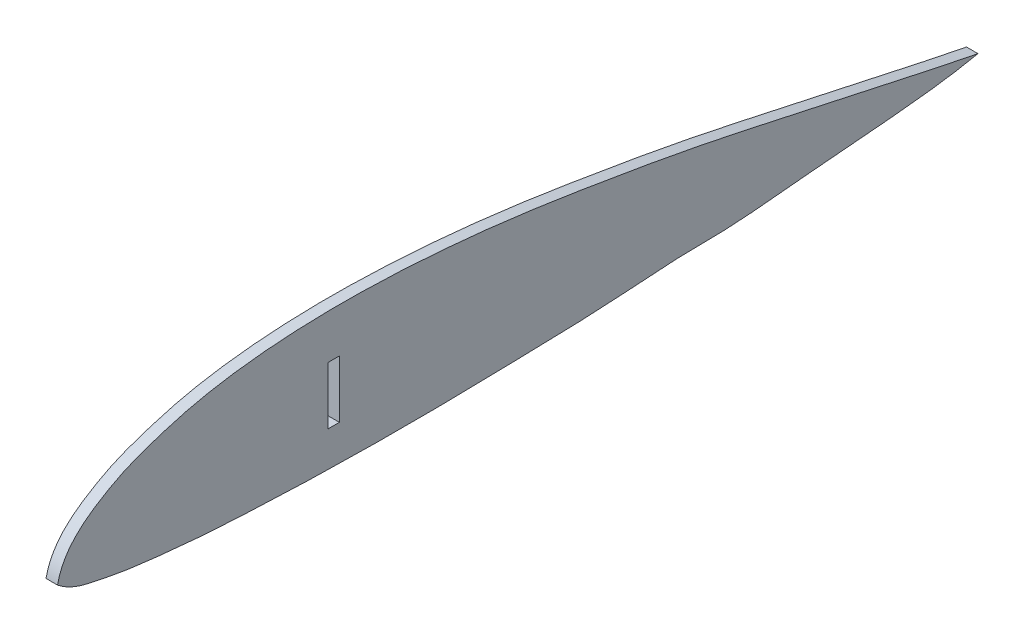
ISO-10303-21;
HEADER;
FILE_DESCRIPTION(('STEP AP214'),'2;1');
FILE_NAME('part.step','',(''),(''),'','','');
FILE_SCHEMA(('AUTOMOTIVE_DESIGN { 1 0 10303 214 1 1 1 1 }'));
ENDSEC;
DATA;
#1=APPLICATION_CONTEXT('core data for automotive mechanical design processes');
#2=APPLICATION_PROTOCOL_DEFINITION('international standard','automotive_design',2000,#1);
#3=PRODUCT_CONTEXT('',#1,'mechanical');
#4=PRODUCT('Part','Part','',(#3));
#5=PRODUCT_RELATED_PRODUCT_CATEGORY('part','',(#4));
#6=PRODUCT_DEFINITION_FORMATION('','',#4);
#7=PRODUCT_DEFINITION_CONTEXT('part definition',#1,'design');
#8=PRODUCT_DEFINITION('design','',#6,#7);
#9=PRODUCT_DEFINITION_SHAPE('','',#8);
#10=(LENGTH_UNIT() NAMED_UNIT(*) SI_UNIT(.MILLI.,.METRE.));
#11=(NAMED_UNIT(*) PLANE_ANGLE_UNIT() SI_UNIT($,.RADIAN.));
#12=(NAMED_UNIT(*) SI_UNIT($,.STERADIAN.) SOLID_ANGLE_UNIT());
#13=UNCERTAINTY_MEASURE_WITH_UNIT(LENGTH_MEASURE(1.E-05),#10,'distance_accuracy_value','');
#14=(GEOMETRIC_REPRESENTATION_CONTEXT(3) GLOBAL_UNCERTAINTY_ASSIGNED_CONTEXT((#13)) GLOBAL_UNIT_ASSIGNED_CONTEXT((#10,
#11,#12)) REPRESENTATION_CONTEXT('',''));
#15=CARTESIAN_POINT('',(0.,0.,0.));
#16=DIRECTION('',(0.,0.,1.));
#17=DIRECTION('',(1.,0.,0.));
#18=AXIS2_PLACEMENT_3D('',#15,#16,#17);
#19=CARTESIAN_POINT('',(3.,0.,240.));
#20=CARTESIAN_POINT('',(3.,-2.88663712280927,236.523911789921));
#21=CARTESIAN_POINT('',(3.,-4.06778606087941,230.220810861395));
#22=CARTESIAN_POINT('',(3.,-5.64877990651582,222.028601874124));
#23=CARTESIAN_POINT('',(3.,-6.60851401532716,214.009642515101));
#24=CARTESIAN_POINT('',(3.,-7.65058139006474,204.019456847261));
#25=CARTESIAN_POINT('',(3.,-8.62100436946901,188.0105436438));
#26=CARTESIAN_POINT('',(3.,-9.35502805275515,168.008371033474));
#27=CARTESIAN_POINT('',(3.,-9.54465584837777,143.997445941081));
#28=CARTESIAN_POINT('',(3.,-9.00057164569615,119.996434597562));
#29=CARTESIAN_POINT('',(3.,-8.45231331914167,95.9841207137069));
#30=CARTESIAN_POINT('',(3.,-6.86154925632092,79.4444514819222));
#31=CARTESIAN_POINT('',(3.,-6.94135781790873,63.4128510279465));
#32=CARTESIAN_POINT('',(3.,-5.14929657813988,47.4214800178839));
#33=CARTESIAN_POINT('',(3.,-3.34616289016771,23.9519910613881));
#34=CARTESIAN_POINT('',(3.,-1.67223814751534,7.91601145609598));
#35=CARTESIAN_POINT('',(3.,0.,0.));
#36=B_SPLINE_CURVE_WITH_KNOTS('',3,(#19,#20,#21,#22,#23,#24,#25,#26,#27,#28,#29,#30,#31,#32,#33,
#34,#35),.UNSPECIFIED.,.F.,.F.,(4,1,1,1,1,1,1,1,1,1,1,1,1,1,4),(0.,0.0534752742490124,
0.078709310431568,0.103753203869046,0.153672751320013,0.203448048800785,0.302856430572072,
0.402198969890009,0.501554024856561,0.600954522211836,0.700430480598882,0.70748041607058,
0.79999645484155,0.899715684831644,1.),.UNSPECIFIED.);
#37=DIRECTION('',(-1.,0.,0.));
#38=VECTOR('',#37,1.);
#39=SURFACE_OF_LINEAR_EXTRUSION('',#36,#38);
#40=CARTESIAN_POINT('',(0.,0.,240.));
#41=CARTESIAN_POINT('',(0.,-2.88663712280927,236.523911789921));
#42=CARTESIAN_POINT('',(0.,-4.06778606087941,230.220810861395));
#43=CARTESIAN_POINT('',(0.,-5.64877990651582,222.028601874124));
#44=CARTESIAN_POINT('',(0.,-6.60851401532716,214.009642515101));
#45=CARTESIAN_POINT('',(0.,-7.65058139006474,204.019456847261));
#46=CARTESIAN_POINT('',(0.,-8.62100436946901,188.0105436438));
#47=CARTESIAN_POINT('',(0.,-9.35502805275515,168.008371033474));
#48=CARTESIAN_POINT('',(0.,-9.54465584837777,143.997445941081));
#49=CARTESIAN_POINT('',(0.,-9.00057164569615,119.996434597562));
#50=CARTESIAN_POINT('',(0.,-8.45231331914167,95.9841207137069));
#51=CARTESIAN_POINT('',(0.,-6.86154925632092,79.4444514819222));
#52=CARTESIAN_POINT('',(0.,-6.94135781790873,63.4128510279465));
#53=CARTESIAN_POINT('',(0.,-5.14929657813988,47.4214800178839));
#54=CARTESIAN_POINT('',(0.,-3.34616289016771,23.9519910613881));
#55=CARTESIAN_POINT('',(0.,-1.67223814751534,7.91601145609598));
#56=CARTESIAN_POINT('',(0.,0.,0.));
#57=B_SPLINE_CURVE_WITH_KNOTS('',3,(#40,#41,#42,#43,#44,#45,#46,#47,#48,#49,#50,#51,#52,#53,#54,
#55,#56),.UNSPECIFIED.,.F.,.F.,(4,1,1,1,1,1,1,1,1,1,1,1,1,1,4),(0.,0.0534752742490124,
0.078709310431568,0.103753203869046,0.153672751320013,0.203448048800785,0.302856430572072,
0.402198969890009,0.501554024856561,0.600954522211836,0.700430480598882,0.70748041607058,
0.79999645484155,0.899715684831644,1.),.UNSPECIFIED.);
#58=CARTESIAN_POINT('',(0.,0.,240.));
#59=VERTEX_POINT('',#58);
#60=CARTESIAN_POINT('',(0.,0.,0.));
#61=VERTEX_POINT('',#60);
#62=EDGE_CURVE('E139',#59,#61,#57,.T.);
#63=ORIENTED_EDGE('',*,*,#62,.T.);
#64=DIRECTION('',(-1.,0.,0.));
#65=VECTOR('',#64,1.);
#66=CARTESIAN_POINT('',(3.,0.,0.));
#67=LINE('',#66,#65);
#68=CARTESIAN_POINT('',(3.,0.,0.));
#69=VERTEX_POINT('',#68);
#70=EDGE_CURVE('E11',#69,#61,#67,.T.);
#71=ORIENTED_EDGE('',*,*,#70,.F.);
#72=CARTESIAN_POINT('',(3.,0.,240.));
#73=VERTEX_POINT('',#72);
#74=EDGE_CURVE('E144',#73,#69,#36,.T.);
#75=ORIENTED_EDGE('',*,*,#74,.F.);
#76=DIRECTION('',(-1.,0.,0.));
#77=VECTOR('',#76,1.);
#78=CARTESIAN_POINT('',(3.,0.,240.));
#79=LINE('',#78,#77);
#80=EDGE_CURVE('E51',#73,#59,#79,.T.);
#81=ORIENTED_EDGE('',*,*,#80,.T.);
#82=EDGE_LOOP('',(#63,#71,#75,#81));
#83=FACE_BOUND('',#82,.T.);
#84=ADVANCED_FACE('F42',(#83),#39,.F.);
#85=CARTESIAN_POINT('',(3.,0.,0.));
#86=CARTESIAN_POINT('',(3.,1.52360068225762,8.03746926130975));
#87=CARTESIAN_POINT('',(3.,5.17138323074117,23.9897917168263));
#88=CARTESIAN_POINT('',(3.,10.2205786034995,48.0059783922376));
#89=CARTESIAN_POINT('',(3.,15.5619770262737,71.9126579513757));
#90=CARTESIAN_POINT('',(3.,19.7588120032883,95.9537600079154));
#91=CARTESIAN_POINT('',(3.,23.5677508672796,119.918298993928));
#92=CARTESIAN_POINT('',(3.,26.0263882263808,143.945589986485));
#93=CARTESIAN_POINT('',(3.,26.9601439821251,168.007150596988));
#94=CARTESIAN_POINT('',(3.,25.8933216802265,188.104616678397));
#95=CARTESIAN_POINT('',(3.,23.2639042392419,204.156129060536));
#96=CARTESIAN_POINT('',(3.,20.3434828261758,214.111867769092));
#97=CARTESIAN_POINT('',(3.,17.4120912155664,222.175332594537));
#98=CARTESIAN_POINT('',(3.,12.3378274401084,231.611968899749));
#99=CARTESIAN_POINT('',(3.,6.88597595591278,238.539586147514));
#100=CARTESIAN_POINT('',(3.,0.,240.));
#101=B_SPLINE_CURVE_WITH_KNOTS('',3,(#85,#86,#87,#88,#89,#90,#91,#92,#93,#94,#95,#96,#97,#98,
#99,#100),.UNSPECIFIED.,.F.,.F.,(4,1,1,1,1,1,1,1,1,1,1,1,1,4),(0.,0.0976537739938577,
0.195364998835535,0.293026196954694,0.390079704897671,0.486695277187024,0.582699676897636,
0.678273314662547,0.77397516907434,0.822435696462195,0.872109787552887,0.897672395288057,
0.924653988799848,1.),.UNSPECIFIED.);
#102=DIRECTION('',(-1.,0.,0.));
#103=VECTOR('',#102,1.);
#104=SURFACE_OF_LINEAR_EXTRUSION('',#101,#103);
#105=CARTESIAN_POINT('',(0.,0.,0.));
#106=CARTESIAN_POINT('',(0.,1.52360068225762,8.03746926130975));
#107=CARTESIAN_POINT('',(0.,5.17138323074117,23.9897917168263));
#108=CARTESIAN_POINT('',(0.,10.2205786034995,48.0059783922376));
#109=CARTESIAN_POINT('',(0.,15.5619770262737,71.9126579513757));
#110=CARTESIAN_POINT('',(0.,19.7588120032883,95.9537600079154));
#111=CARTESIAN_POINT('',(0.,23.5677508672796,119.918298993928));
#112=CARTESIAN_POINT('',(0.,26.0263882263808,143.945589986485));
#113=CARTESIAN_POINT('',(0.,26.9601439821251,168.007150596988));
#114=CARTESIAN_POINT('',(0.,25.8933216802265,188.104616678397));
#115=CARTESIAN_POINT('',(0.,23.2639042392419,204.156129060536));
#116=CARTESIAN_POINT('',(0.,20.3434828261758,214.111867769092));
#117=CARTESIAN_POINT('',(0.,17.4120912155664,222.175332594537));
#118=CARTESIAN_POINT('',(0.,12.3378274401084,231.611968899749));
#119=CARTESIAN_POINT('',(0.,6.88597595591278,238.539586147514));
#120=CARTESIAN_POINT('',(0.,0.,240.));
#121=B_SPLINE_CURVE_WITH_KNOTS('',3,(#105,#106,#107,#108,#109,#110,#111,#112,#113,#114,#115,
#116,#117,#118,#119,#120),.UNSPECIFIED.,.F.,.F.,(4,1,1,1,1,1,1,1,1,1,1,1,1,4),(0.,
0.0976537739938577,0.195364998835535,0.293026196954694,0.390079704897671,0.486695277187024,
0.582699676897636,0.678273314662547,0.77397516907434,0.822435696462195,0.872109787552887,
0.897672395288057,0.924653988799848,1.),.UNSPECIFIED.);
#122=EDGE_CURVE('E152',#61,#59,#121,.T.);
#123=ORIENTED_EDGE('',*,*,#122,.T.);
#124=ORIENTED_EDGE('',*,*,#80,.F.);
#125=EDGE_CURVE('E151',#69,#73,#101,.T.);
#126=ORIENTED_EDGE('',*,*,#125,.F.);
#127=ORIENTED_EDGE('',*,*,#70,.T.);
#128=EDGE_LOOP('',(#123,#124,#126,#127));
#129=FACE_BOUND('',#128,.T.);
#130=ADVANCED_FACE('F167',(#129),#104,.F.);
#131=CARTESIAN_POINT('',(3.,-9.00853891874286,120.375365675922));
#132=DIRECTION('',(-1.,0.,0.));
#133=DIRECTION('',(0.,0.,1.));
#134=AXIS2_PLACEMENT_3D('',#131,#132,#133);
#135=PLANE('',#134);
#136=DIRECTION('',(0.,-1.,0.));
#137=VECTOR('',#136,1.);
#138=CARTESIAN_POINT('',(3.,15.,166.5));
#139=LINE('',#138,#137);
#140=CARTESIAN_POINT('',(3.,15.,166.5));
#141=VERTEX_POINT('',#140);
#142=CARTESIAN_POINT('',(3.,0.,166.5));
#143=VERTEX_POINT('',#142);
#144=EDGE_CURVE('E105',#141,#143,#139,.T.);
#145=ORIENTED_EDGE('',*,*,#144,.T.);
#146=DIRECTION('',(0.,0.,1.));
#147=VECTOR('',#146,1.);
#148=CARTESIAN_POINT('',(3.,0.,166.5));
#149=LINE('',#148,#147);
#150=CARTESIAN_POINT('',(3.,0.,169.5));
#151=VERTEX_POINT('',#150);
#152=EDGE_CURVE('E98',#143,#151,#149,.T.);
#153=ORIENTED_EDGE('',*,*,#152,.T.);
#154=DIRECTION('',(0.,1.,0.));
#155=VECTOR('',#154,1.);
#156=CARTESIAN_POINT('',(3.,0.,169.5));
#157=LINE('',#156,#155);
#158=CARTESIAN_POINT('',(3.,15.,169.5));
#159=VERTEX_POINT('',#158);
#160=EDGE_CURVE('E108',#151,#159,#157,.T.);
#161=ORIENTED_EDGE('',*,*,#160,.T.);
#162=DIRECTION('',(0.,0.,-1.));
#163=VECTOR('',#162,1.);
#164=CARTESIAN_POINT('',(3.,15.,169.5));
#165=LINE('',#164,#163);
#166=EDGE_CURVE('E58',#159,#141,#165,.T.);
#167=ORIENTED_EDGE('',*,*,#166,.T.);
#168=EDGE_LOOP('',(#145,#153,#161,#167));
#169=FACE_BOUND('',#168,.T.);
#170=ORIENTED_EDGE('',*,*,#74,.T.);
#171=ORIENTED_EDGE('',*,*,#125,.T.);
#172=EDGE_LOOP('',(#170,#171));
#173=FACE_BOUND('',#172,.T.);
#174=ADVANCED_FACE('F113',(#169,#173),#135,.F.);
#175=CARTESIAN_POINT('',(0.,-9.00853891874286,120.375365675922));
#176=DIRECTION('',(-1.,0.,0.));
#177=DIRECTION('',(0.,0.,1.));
#178=AXIS2_PLACEMENT_3D('',#175,#176,#177);
#179=PLANE('',#178);
#180=DIRECTION('',(0.,0.,1.));
#181=VECTOR('',#180,1.);
#182=CARTESIAN_POINT('',(0.,0.,166.5));
#183=LINE('',#182,#181);
#184=CARTESIAN_POINT('',(0.,0.,166.5));
#185=VERTEX_POINT('',#184);
#186=CARTESIAN_POINT('',(0.,0.,169.5));
#187=VERTEX_POINT('',#186);
#188=EDGE_CURVE('E66',#185,#187,#183,.T.);
#189=ORIENTED_EDGE('',*,*,#188,.F.);
#190=DIRECTION('',(0.,-1.,0.));
#191=VECTOR('',#190,1.);
#192=CARTESIAN_POINT('',(0.,15.,166.5));
#193=LINE('',#192,#191);
#194=CARTESIAN_POINT('',(0.,15.,166.5));
#195=VERTEX_POINT('',#194);
#196=EDGE_CURVE('E117',#195,#185,#193,.T.);
#197=ORIENTED_EDGE('',*,*,#196,.F.);
#198=DIRECTION('',(0.,0.,-1.));
#199=VECTOR('',#198,1.);
#200=CARTESIAN_POINT('',(0.,15.,169.5));
#201=LINE('',#200,#199);
#202=CARTESIAN_POINT('',(0.,15.,169.5));
#203=VERTEX_POINT('',#202);
#204=EDGE_CURVE('E121',#203,#195,#201,.T.);
#205=ORIENTED_EDGE('',*,*,#204,.F.);
#206=DIRECTION('',(0.,1.,0.));
#207=VECTOR('',#206,1.);
#208=CARTESIAN_POINT('',(0.,0.,169.5));
#209=LINE('',#208,#207);
#210=EDGE_CURVE('E130',#187,#203,#209,.T.);
#211=ORIENTED_EDGE('',*,*,#210,.F.);
#212=EDGE_LOOP('',(#189,#197,#205,#211));
#213=FACE_BOUND('',#212,.T.);
#214=ORIENTED_EDGE('',*,*,#62,.F.);
#215=ORIENTED_EDGE('',*,*,#122,.F.);
#216=EDGE_LOOP('',(#214,#215));
#217=FACE_BOUND('',#216,.T.);
#218=ADVANCED_FACE('F171',(#213,#217),#179,.T.);
#219=CARTESIAN_POINT('',(3.,0.,166.5));
#220=DIRECTION('',(0.,-1.,0.));
#221=DIRECTION('',(0.,0.,-1.));
#222=AXIS2_PLACEMENT_3D('',#219,#220,#221);
#223=PLANE('',#222);
#224=ORIENTED_EDGE('',*,*,#188,.T.);
#225=DIRECTION('',(-1.,0.,0.));
#226=VECTOR('',#225,1.);
#227=CARTESIAN_POINT('',(3.,0.,169.5));
#228=LINE('',#227,#226);
#229=EDGE_CURVE('E94',#151,#187,#228,.T.);
#230=ORIENTED_EDGE('',*,*,#229,.F.);
#231=ORIENTED_EDGE('',*,*,#152,.F.);
#232=DIRECTION('',(-1.,0.,0.));
#233=VECTOR('',#232,1.);
#234=CARTESIAN_POINT('',(3.,0.,166.5));
#235=LINE('',#234,#233);
#236=EDGE_CURVE('E136',#143,#185,#235,.T.);
#237=ORIENTED_EDGE('',*,*,#236,.T.);
#238=EDGE_LOOP('',(#224,#230,#231,#237));
#239=FACE_BOUND('',#238,.T.);
#240=ADVANCED_FACE('F96',(#239),#223,.F.);
#241=CARTESIAN_POINT('',(3.,15.,166.5));
#242=DIRECTION('',(0.,0.,-1.));
#243=DIRECTION('',(-1.,0.,0.));
#244=AXIS2_PLACEMENT_3D('',#241,#242,#243);
#245=PLANE('',#244);
#246=ORIENTED_EDGE('',*,*,#196,.T.);
#247=ORIENTED_EDGE('',*,*,#236,.F.);
#248=ORIENTED_EDGE('',*,*,#144,.F.);
#249=DIRECTION('',(-1.,0.,0.));
#250=VECTOR('',#249,1.);
#251=CARTESIAN_POINT('',(3.,15.,166.5));
#252=LINE('',#251,#250);
#253=EDGE_CURVE('E140',#141,#195,#252,.T.);
#254=ORIENTED_EDGE('',*,*,#253,.T.);
#255=EDGE_LOOP('',(#246,#247,#248,#254));
#256=FACE_BOUND('',#255,.T.);
#257=ADVANCED_FACE('F179',(#256),#245,.F.);
#258=CARTESIAN_POINT('',(3.,15.,169.5));
#259=DIRECTION('',(0.,1.,0.));
#260=DIRECTION('',(0.,0.,1.));
#261=AXIS2_PLACEMENT_3D('',#258,#259,#260);
#262=PLANE('',#261);
#263=ORIENTED_EDGE('',*,*,#204,.T.);
#264=ORIENTED_EDGE('',*,*,#253,.F.);
#265=ORIENTED_EDGE('',*,*,#166,.F.);
#266=DIRECTION('',(-1.,0.,0.));
#267=VECTOR('',#266,1.);
#268=CARTESIAN_POINT('',(3.,15.,169.5));
#269=LINE('',#268,#267);
#270=EDGE_CURVE('E104',#159,#203,#269,.T.);
#271=ORIENTED_EDGE('',*,*,#270,.T.);
#272=EDGE_LOOP('',(#263,#264,#265,#271));
#273=FACE_BOUND('',#272,.T.);
#274=ADVANCED_FACE('F182',(#273),#262,.F.);
#275=CARTESIAN_POINT('',(3.,0.,169.5));
#276=DIRECTION('',(0.,0.,1.));
#277=DIRECTION('',(1.,0.,0.));
#278=AXIS2_PLACEMENT_3D('',#275,#276,#277);
#279=PLANE('',#278);
#280=ORIENTED_EDGE('',*,*,#210,.T.);
#281=ORIENTED_EDGE('',*,*,#270,.F.);
#282=ORIENTED_EDGE('',*,*,#160,.F.);
#283=ORIENTED_EDGE('',*,*,#229,.T.);
#284=EDGE_LOOP('',(#280,#281,#282,#283));
#285=FACE_BOUND('',#284,.T.);
#286=ADVANCED_FACE('F109',(#285),#279,.F.);
#287=CLOSED_SHELL('',(#84,#130,#174,#218,#240,#257,#274,#286));
#288=MANIFOLD_SOLID_BREP('B2',#287);
#289=ADVANCED_BREP_SHAPE_REPRESENTATION('',(#18,#288),#14);
#290=SHAPE_DEFINITION_REPRESENTATION(#9,#289);
ENDSEC;
END-ISO-10303-21;
